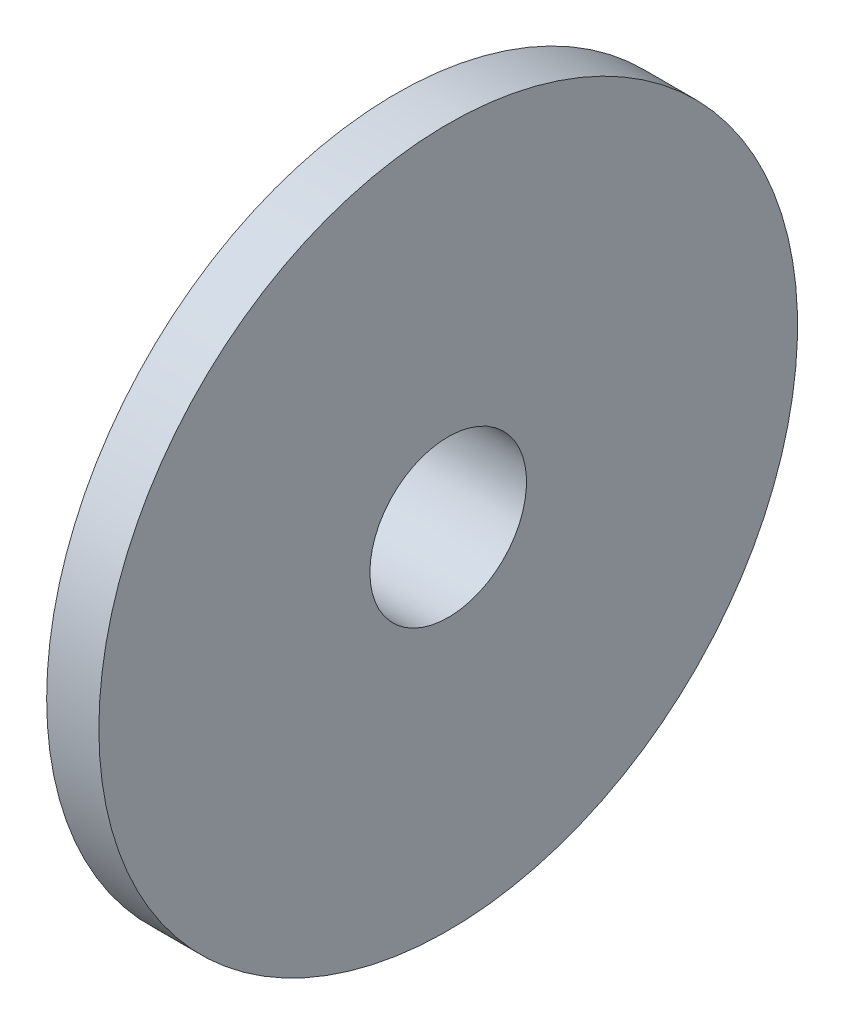
ISO-10303-21;
HEADER;
FILE_DESCRIPTION(('STEP AP214'),'2;1');
FILE_NAME('part.step','',(''),(''),'','','');
FILE_SCHEMA(('AUTOMOTIVE_DESIGN { 1 0 10303 214 1 1 1 1 }'));
ENDSEC;
DATA;
#1=APPLICATION_CONTEXT('core data for automotive mechanical design processes');
#2=APPLICATION_PROTOCOL_DEFINITION('international standard','automotive_design',2000,#1);
#3=PRODUCT_CONTEXT('',#1,'mechanical');
#4=PRODUCT('Part','Part','',(#3));
#5=PRODUCT_RELATED_PRODUCT_CATEGORY('part','',(#4));
#6=PRODUCT_DEFINITION_FORMATION('','',#4);
#7=PRODUCT_DEFINITION_CONTEXT('part definition',#1,'design');
#8=PRODUCT_DEFINITION('design','',#6,#7);
#9=PRODUCT_DEFINITION_SHAPE('','',#8);
#10=(LENGTH_UNIT() NAMED_UNIT(*) SI_UNIT(.MILLI.,.METRE.));
#11=(NAMED_UNIT(*) PLANE_ANGLE_UNIT() SI_UNIT($,.RADIAN.));
#12=(NAMED_UNIT(*) SI_UNIT($,.STERADIAN.) SOLID_ANGLE_UNIT());
#13=UNCERTAINTY_MEASURE_WITH_UNIT(LENGTH_MEASURE(1.E-05),#10,'distance_accuracy_value','');
#14=(GEOMETRIC_REPRESENTATION_CONTEXT(3) GLOBAL_UNCERTAINTY_ASSIGNED_CONTEXT((#13)) GLOBAL_UNIT_ASSIGNED_CONTEXT((#10,
#11,#12)) REPRESENTATION_CONTEXT('',''));
#15=CARTESIAN_POINT('',(0.,0.,0.));
#16=DIRECTION('',(0.,0.,1.));
#17=DIRECTION('',(1.,0.,0.));
#18=AXIS2_PLACEMENT_3D('',#15,#16,#17);
#19=CARTESIAN_POINT('',(-9.09999999999998,0.,0.));
#20=DIRECTION('',(-1.,0.,0.));
#21=DIRECTION('',(0.,0.,1.));
#22=AXIS2_PLACEMENT_3D('',#19,#20,#21);
#23=CYLINDRICAL_SURFACE('',#22,1.5);
#24=CARTESIAN_POINT('',(-2.8,0.,0.));
#25=DIRECTION('',(1.,0.,0.));
#26=DIRECTION('',(0.,0.,-1.));
#27=AXIS2_PLACEMENT_3D('',#24,#25,#26);
#28=CIRCLE('',#27,1.5);
#29=CARTESIAN_POINT('',(-2.8,0.,-1.5));
#30=VERTEX_POINT('',#29);
#31=EDGE_CURVE('E10',#30,#30,#28,.F.);
#32=ORIENTED_EDGE('',*,*,#31,.T.);
#33=EDGE_LOOP('',(#32));
#34=FACE_BOUND('',#33,.T.);
#35=CARTESIAN_POINT('',(0.,0.,0.));
#36=DIRECTION('',(-1.,0.,0.));
#37=DIRECTION('',(0.,0.,1.));
#38=AXIS2_PLACEMENT_3D('',#35,#36,#37);
#39=CIRCLE('',#38,1.5);
#40=CARTESIAN_POINT('',(0.,0.,1.5));
#41=VERTEX_POINT('',#40);
#42=EDGE_CURVE('E55',#41,#41,#39,.T.);
#43=ORIENTED_EDGE('',*,*,#42,.F.);
#44=EDGE_LOOP('',(#43));
#45=FACE_BOUND('',#44,.T.);
#46=ADVANCED_FACE('F35',(#34,#45),#23,.F.);
#47=CARTESIAN_POINT('',(0.,1.5,0.));
#48=DIRECTION('',(-1.,0.,0.));
#49=DIRECTION('',(0.,0.,1.));
#50=AXIS2_PLACEMENT_3D('',#47,#48,#49);
#51=PLANE('',#50);
#52=CARTESIAN_POINT('',(0.,0.,0.));
#53=DIRECTION('',(-1.,0.,0.));
#54=DIRECTION('',(0.,0.,1.));
#55=AXIS2_PLACEMENT_3D('',#52,#53,#54);
#56=CIRCLE('',#55,6.69285714285714);
#57=CARTESIAN_POINT('',(0.,0.,6.69285714285714));
#58=VERTEX_POINT('',#57);
#59=EDGE_CURVE('E58',#58,#58,#56,.T.);
#60=ORIENTED_EDGE('',*,*,#59,.F.);
#61=EDGE_LOOP('',(#60));
#62=FACE_BOUND('',#61,.T.);
#63=ORIENTED_EDGE('',*,*,#42,.T.);
#64=EDGE_LOOP('',(#63));
#65=FACE_BOUND('',#64,.T.);
#66=ADVANCED_FACE('F79',(#62,#65),#51,.F.);
#67=CARTESIAN_POINT('',(-9.09999999999998,0.,0.));
#68=DIRECTION('',(-1.,0.,0.));
#69=DIRECTION('',(0.,0.,1.));
#70=AXIS2_PLACEMENT_3D('',#67,#68,#69);
#71=CYLINDRICAL_SURFACE('',#70,6.69285714285714);
#72=CARTESIAN_POINT('',(-1.,0.,0.));
#73=DIRECTION('',(-1.,0.,0.));
#74=DIRECTION('',(0.,0.,1.));
#75=AXIS2_PLACEMENT_3D('',#72,#73,#74);
#76=CIRCLE('',#75,6.69285714285714);
#77=CARTESIAN_POINT('',(-1.,0.,6.69285714285714));
#78=VERTEX_POINT('',#77);
#79=EDGE_CURVE('E61',#78,#78,#76,.T.);
#80=ORIENTED_EDGE('',*,*,#79,.F.);
#81=EDGE_LOOP('',(#80));
#82=FACE_BOUND('',#81,.T.);
#83=ORIENTED_EDGE('',*,*,#59,.T.);
#84=EDGE_LOOP('',(#83));
#85=FACE_BOUND('',#84,.T.);
#86=ADVANCED_FACE('F73',(#82,#85),#71,.T.);
#87=CARTESIAN_POINT('',(-1.,6.69285714285714,0.));
#88=DIRECTION('',(1.,0.,0.));
#89=DIRECTION('',(0.,0.,-1.));
#90=AXIS2_PLACEMENT_3D('',#87,#88,#89);
#91=PLANE('',#90);
#92=CARTESIAN_POINT('',(-0.999999999999999,0.,0.));
#93=DIRECTION('',(-1.,0.,0.));
#94=DIRECTION('',(0.,0.,1.));
#95=AXIS2_PLACEMENT_3D('',#92,#93,#94);
#96=CIRCLE('',#95,2.75);
#97=CARTESIAN_POINT('',(-0.999999999999999,0.,2.75));
#98=VERTEX_POINT('',#97);
#99=EDGE_CURVE('E64',#98,#98,#96,.T.);
#100=ORIENTED_EDGE('',*,*,#99,.F.);
#101=EDGE_LOOP('',(#100));
#102=FACE_BOUND('',#101,.T.);
#103=ORIENTED_EDGE('',*,*,#79,.T.);
#104=EDGE_LOOP('',(#103));
#105=FACE_BOUND('',#104,.T.);
#106=ADVANCED_FACE('F70',(#102,#105),#91,.F.);
#107=CARTESIAN_POINT('',(-9.09999999999998,0.,0.));
#108=DIRECTION('',(-1.,0.,0.));
#109=DIRECTION('',(0.,0.,1.));
#110=AXIS2_PLACEMENT_3D('',#107,#108,#109);
#111=CYLINDRICAL_SURFACE('',#110,2.75);
#112=CARTESIAN_POINT('',(-2.8,0.,0.));
#113=DIRECTION('',(1.,0.,0.));
#114=DIRECTION('',(0.,0.,-1.));
#115=AXIS2_PLACEMENT_3D('',#112,#113,#114);
#116=CIRCLE('',#115,2.75);
#117=CARTESIAN_POINT('',(-2.8,0.,-2.75));
#118=VERTEX_POINT('',#117);
#119=EDGE_CURVE('E42',#118,#118,#116,.T.);
#120=ORIENTED_EDGE('',*,*,#119,.T.);
#121=EDGE_LOOP('',(#120));
#122=FACE_BOUND('',#121,.T.);
#123=ORIENTED_EDGE('',*,*,#99,.T.);
#124=EDGE_LOOP('',(#123));
#125=FACE_BOUND('',#124,.T.);
#126=ADVANCED_FACE('F68',(#122,#125),#111,.T.);
#127=CARTESIAN_POINT('',(-3.,2.75,0.));
#128=DIRECTION('',(1.,0.,0.));
#129=DIRECTION('',(0.,0.,-1.));
#130=AXIS2_PLACEMENT_3D('',#127,#128,#129);
#131=PLANE('',#130);
#132=CARTESIAN_POINT('',(-3.,0.,0.));
#133=DIRECTION('',(1.,0.,0.));
#134=DIRECTION('',(0.,0.,-1.));
#135=AXIS2_PLACEMENT_3D('',#132,#133,#134);
#136=CIRCLE('',#135,2.55);
#137=CARTESIAN_POINT('',(-3.,0.,-2.55));
#138=VERTEX_POINT('',#137);
#139=EDGE_CURVE('E46',#138,#138,#136,.F.);
#140=ORIENTED_EDGE('',*,*,#139,.T.);
#141=EDGE_LOOP('',(#140));
#142=FACE_BOUND('',#141,.T.);
#143=CARTESIAN_POINT('',(-3.,0.,0.));
#144=DIRECTION('',(1.,0.,0.));
#145=DIRECTION('',(0.,0.,-1.));
#146=AXIS2_PLACEMENT_3D('',#143,#144,#145);
#147=CIRCLE('',#146,1.7);
#148=CARTESIAN_POINT('',(-3.,0.,-1.7));
#149=VERTEX_POINT('',#148);
#150=EDGE_CURVE('E50',#149,#149,#147,.T.);
#151=ORIENTED_EDGE('',*,*,#150,.T.);
#152=EDGE_LOOP('',(#151));
#153=FACE_BOUND('',#152,.T.);
#154=ADVANCED_FACE('F94',(#142,#153),#131,.F.);
#155=CARTESIAN_POINT('',(-3.,0.,0.));
#156=DIRECTION('',(1.,0.,0.));
#157=DIRECTION('',(0.,0.,-1.));
#158=AXIS2_PLACEMENT_3D('',#155,#156,#157);
#159=CONICAL_SURFACE('',#158,2.55,0.785398163397455);
#160=ORIENTED_EDGE('',*,*,#119,.F.);
#161=EDGE_LOOP('',(#160));
#162=FACE_BOUND('',#161,.T.);
#163=ORIENTED_EDGE('',*,*,#139,.F.);
#164=EDGE_LOOP('',(#163));
#165=FACE_BOUND('',#164,.T.);
#166=ADVANCED_FACE('F92',(#162,#165),#159,.T.);
#167=CARTESIAN_POINT('',(-2.8,0.,0.));
#168=DIRECTION('',(-1.,0.,0.));
#169=DIRECTION('',(0.,0.,1.));
#170=AXIS2_PLACEMENT_3D('',#167,#168,#169);
#171=CONICAL_SURFACE('',#170,1.5,0.785398163397449);
#172=ORIENTED_EDGE('',*,*,#150,.F.);
#173=EDGE_LOOP('',(#172));
#174=FACE_BOUND('',#173,.T.);
#175=ORIENTED_EDGE('',*,*,#31,.F.);
#176=EDGE_LOOP('',(#175));
#177=FACE_BOUND('',#176,.T.);
#178=ADVANCED_FACE('F37',(#174,#177),#171,.F.);
#179=CLOSED_SHELL('',(#46,#66,#86,#106,#126,#154,#166,#178));
#180=MANIFOLD_SOLID_BREP('B2',#179);
#181=ADVANCED_BREP_SHAPE_REPRESENTATION('',(#18,#180),#14);
#182=SHAPE_DEFINITION_REPRESENTATION(#9,#181);
ENDSEC;
END-ISO-10303-21;
